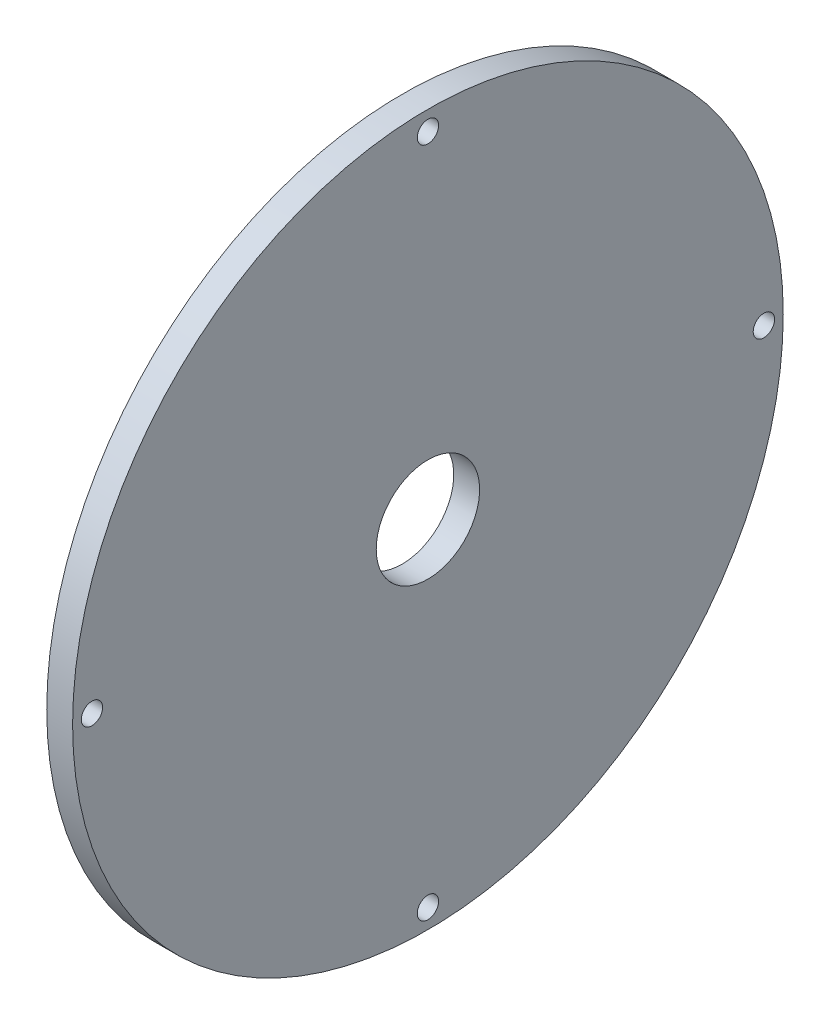
ISO-10303-21;
HEADER;
FILE_DESCRIPTION(('STEP AP214'),'2;1');
FILE_NAME('part.step','',(''),(''),'','','');
FILE_SCHEMA(('AUTOMOTIVE_DESIGN { 1 0 10303 214 1 1 1 1 }'));
ENDSEC;
DATA;
#1=APPLICATION_CONTEXT('core data for automotive mechanical design processes');
#2=APPLICATION_PROTOCOL_DEFINITION('international standard','automotive_design',2000,#1);
#3=PRODUCT_CONTEXT('',#1,'mechanical');
#4=PRODUCT('Part','Part','',(#3));
#5=PRODUCT_RELATED_PRODUCT_CATEGORY('part','',(#4));
#6=PRODUCT_DEFINITION_FORMATION('','',#4);
#7=PRODUCT_DEFINITION_CONTEXT('part definition',#1,'design');
#8=PRODUCT_DEFINITION('design','',#6,#7);
#9=PRODUCT_DEFINITION_SHAPE('','',#8);
#10=(LENGTH_UNIT() NAMED_UNIT(*) SI_UNIT(.MILLI.,.METRE.));
#11=(NAMED_UNIT(*) PLANE_ANGLE_UNIT() SI_UNIT($,.RADIAN.));
#12=(NAMED_UNIT(*) SI_UNIT($,.STERADIAN.) SOLID_ANGLE_UNIT());
#13=UNCERTAINTY_MEASURE_WITH_UNIT(LENGTH_MEASURE(1.E-05),#10,'distance_accuracy_value','');
#14=(GEOMETRIC_REPRESENTATION_CONTEXT(3) GLOBAL_UNCERTAINTY_ASSIGNED_CONTEXT((#13)) GLOBAL_UNIT_ASSIGNED_CONTEXT((#10,
#11,#12)) REPRESENTATION_CONTEXT('',''));
#15=CARTESIAN_POINT('',(0.,0.,0.));
#16=DIRECTION('',(0.,0.,1.));
#17=DIRECTION('',(1.,0.,0.));
#18=AXIS2_PLACEMENT_3D('',#15,#16,#17);
#19=CARTESIAN_POINT('',(-130.,55.,0.));
#20=DIRECTION('',(1.,0.,0.));
#21=DIRECTION('',(0.,0.,-1.));
#22=AXIS2_PLACEMENT_3D('',#19,#20,#21);
#23=PLANE('',#22);
#24=CARTESIAN_POINT('',(-130.,52.,0.));
#25=DIRECTION('',(1.,0.,0.));
#26=DIRECTION('',(0.,0.,-1.));
#27=AXIS2_PLACEMENT_3D('',#24,#25,#26);
#28=CIRCLE('',#27,1.65);
#29=CARTESIAN_POINT('',(-130.,52.,-1.65));
#30=VERTEX_POINT('',#29);
#31=EDGE_CURVE('E51',#30,#30,#28,.T.);
#32=ORIENTED_EDGE('',*,*,#31,.T.);
#33=EDGE_LOOP('',(#32));
#34=FACE_BOUND('',#33,.T.);
#35=CARTESIAN_POINT('',(-130.,0.,52.));
#36=DIRECTION('',(1.,0.,0.));
#37=DIRECTION('',(0.,0.,-1.));
#38=AXIS2_PLACEMENT_3D('',#35,#36,#37);
#39=CIRCLE('',#38,1.65);
#40=CARTESIAN_POINT('',(-130.,0.,50.35));
#41=VERTEX_POINT('',#40);
#42=EDGE_CURVE('E73',#41,#41,#39,.T.);
#43=ORIENTED_EDGE('',*,*,#42,.T.);
#44=EDGE_LOOP('',(#43));
#45=FACE_BOUND('',#44,.T.);
#46=CARTESIAN_POINT('',(-130.,-52.,0.));
#47=DIRECTION('',(1.,0.,0.));
#48=DIRECTION('',(0.,0.,-1.));
#49=AXIS2_PLACEMENT_3D('',#46,#47,#48);
#50=CIRCLE('',#49,1.65);
#51=CARTESIAN_POINT('',(-130.,-52.,-1.64999999999999));
#52=VERTEX_POINT('',#51);
#53=EDGE_CURVE('E70',#52,#52,#50,.T.);
#54=ORIENTED_EDGE('',*,*,#53,.T.);
#55=EDGE_LOOP('',(#54));
#56=FACE_BOUND('',#55,.T.);
#57=CARTESIAN_POINT('',(-130.,0.,-52.));
#58=DIRECTION('',(1.,0.,0.));
#59=DIRECTION('',(0.,0.,-1.));
#60=AXIS2_PLACEMENT_3D('',#57,#58,#59);
#61=CIRCLE('',#60,1.65);
#62=CARTESIAN_POINT('',(-130.,0.,-53.65));
#63=VERTEX_POINT('',#62);
#64=EDGE_CURVE('E67',#63,#63,#61,.T.);
#65=ORIENTED_EDGE('',*,*,#64,.T.);
#66=EDGE_LOOP('',(#65));
#67=FACE_BOUND('',#66,.T.);
#68=CARTESIAN_POINT('',(-130.,0.,0.));
#69=DIRECTION('',(-1.,0.,0.));
#70=DIRECTION('',(0.,0.,1.));
#71=AXIS2_PLACEMENT_3D('',#68,#69,#70);
#72=CIRCLE('',#71,8.);
#73=CARTESIAN_POINT('',(-130.,0.,8.));
#74=VERTEX_POINT('',#73);
#75=EDGE_CURVE('E10',#74,#74,#72,.T.);
#76=ORIENTED_EDGE('',*,*,#75,.F.);
#77=EDGE_LOOP('',(#76));
#78=FACE_BOUND('',#77,.T.);
#79=CARTESIAN_POINT('',(-130.,0.,0.));
#80=DIRECTION('',(-1.,0.,0.));
#81=DIRECTION('',(0.,0.,1.));
#82=AXIS2_PLACEMENT_3D('',#79,#80,#81);
#83=CIRCLE('',#82,55.);
#84=CARTESIAN_POINT('',(-130.,0.,55.));
#85=VERTEX_POINT('',#84);
#86=EDGE_CURVE('E58',#85,#85,#83,.T.);
#87=ORIENTED_EDGE('',*,*,#86,.T.);
#88=EDGE_LOOP('',(#87));
#89=FACE_BOUND('',#88,.T.);
#90=ADVANCED_FACE('F31',(#34,#45,#56,#67,#78,#89),#23,.F.);
#91=CARTESIAN_POINT('',(-110.,0.,0.));
#92=DIRECTION('',(-1.,0.,0.));
#93=DIRECTION('',(0.,0.,1.));
#94=AXIS2_PLACEMENT_3D('',#91,#92,#93);
#95=CYLINDRICAL_SURFACE('',#94,8.);
#96=CARTESIAN_POINT('',(-126.,0.,0.));
#97=DIRECTION('',(-1.,0.,0.));
#98=DIRECTION('',(0.,0.,1.));
#99=AXIS2_PLACEMENT_3D('',#96,#97,#98);
#100=CIRCLE('',#99,8.);
#101=CARTESIAN_POINT('',(-126.,0.,8.));
#102=VERTEX_POINT('',#101);
#103=EDGE_CURVE('E38',#102,#102,#100,.T.);
#104=ORIENTED_EDGE('',*,*,#103,.F.);
#105=EDGE_LOOP('',(#104));
#106=FACE_BOUND('',#105,.T.);
#107=ORIENTED_EDGE('',*,*,#75,.T.);
#108=EDGE_LOOP('',(#107));
#109=FACE_BOUND('',#108,.T.);
#110=ADVANCED_FACE('F93',(#106,#109),#95,.F.);
#111=CARTESIAN_POINT('',(-126.,8.,0.));
#112=DIRECTION('',(-1.,0.,0.));
#113=DIRECTION('',(0.,0.,1.));
#114=AXIS2_PLACEMENT_3D('',#111,#112,#113);
#115=PLANE('',#114);
#116=CARTESIAN_POINT('',(-126.,52.,0.));
#117=DIRECTION('',(-1.,0.,0.));
#118=DIRECTION('',(0.,0.,1.));
#119=AXIS2_PLACEMENT_3D('',#116,#117,#118);
#120=CIRCLE('',#119,1.65);
#121=CARTESIAN_POINT('',(-126.,52.,1.65));
#122=VERTEX_POINT('',#121);
#123=EDGE_CURVE('E34',#122,#122,#120,.T.);
#124=ORIENTED_EDGE('',*,*,#123,.T.);
#125=EDGE_LOOP('',(#124));
#126=FACE_BOUND('',#125,.T.);
#127=CARTESIAN_POINT('',(-126.,0.,52.));
#128=DIRECTION('',(-1.,0.,0.));
#129=DIRECTION('',(0.,0.,1.));
#130=AXIS2_PLACEMENT_3D('',#127,#128,#129);
#131=CIRCLE('',#130,1.65);
#132=CARTESIAN_POINT('',(-126.,0.,53.65));
#133=VERTEX_POINT('',#132);
#134=EDGE_CURVE('E53',#133,#133,#131,.T.);
#135=ORIENTED_EDGE('',*,*,#134,.T.);
#136=EDGE_LOOP('',(#135));
#137=FACE_BOUND('',#136,.T.);
#138=CARTESIAN_POINT('',(-126.,-52.,0.));
#139=DIRECTION('',(-1.,0.,0.));
#140=DIRECTION('',(0.,0.,1.));
#141=AXIS2_PLACEMENT_3D('',#138,#139,#140);
#142=CIRCLE('',#141,1.65);
#143=CARTESIAN_POINT('',(-126.,-52.,1.65000000000001));
#144=VERTEX_POINT('',#143);
#145=EDGE_CURVE('E50',#144,#144,#142,.T.);
#146=ORIENTED_EDGE('',*,*,#145,.T.);
#147=EDGE_LOOP('',(#146));
#148=FACE_BOUND('',#147,.T.);
#149=CARTESIAN_POINT('',(-126.,0.,-52.));
#150=DIRECTION('',(-1.,0.,0.));
#151=DIRECTION('',(0.,0.,1.));
#152=AXIS2_PLACEMENT_3D('',#149,#150,#151);
#153=CIRCLE('',#152,1.65);
#154=CARTESIAN_POINT('',(-126.,0.,-50.35));
#155=VERTEX_POINT('',#154);
#156=EDGE_CURVE('E47',#155,#155,#153,.T.);
#157=ORIENTED_EDGE('',*,*,#156,.T.);
#158=EDGE_LOOP('',(#157));
#159=FACE_BOUND('',#158,.T.);
#160=CARTESIAN_POINT('',(-126.,0.,0.));
#161=DIRECTION('',(-1.,0.,0.));
#162=DIRECTION('',(0.,0.,1.));
#163=AXIS2_PLACEMENT_3D('',#160,#161,#162);
#164=CIRCLE('',#163,55.);
#165=CARTESIAN_POINT('',(-126.,0.,55.));
#166=VERTEX_POINT('',#165);
#167=EDGE_CURVE('E43',#166,#166,#164,.T.);
#168=ORIENTED_EDGE('',*,*,#167,.F.);
#169=EDGE_LOOP('',(#168));
#170=FACE_BOUND('',#169,.T.);
#171=ORIENTED_EDGE('',*,*,#103,.T.);
#172=EDGE_LOOP('',(#171));
#173=FACE_BOUND('',#172,.T.);
#174=ADVANCED_FACE('F97',(#126,#137,#148,#159,#170,#173),#115,.F.);
#175=CARTESIAN_POINT('',(-110.,0.,0.));
#176=DIRECTION('',(-1.,0.,0.));
#177=DIRECTION('',(0.,0.,1.));
#178=AXIS2_PLACEMENT_3D('',#175,#176,#177);
#179=CYLINDRICAL_SURFACE('',#178,55.);
#180=ORIENTED_EDGE('',*,*,#86,.F.);
#181=EDGE_LOOP('',(#180));
#182=FACE_BOUND('',#181,.T.);
#183=ORIENTED_EDGE('',*,*,#167,.T.);
#184=EDGE_LOOP('',(#183));
#185=FACE_BOUND('',#184,.T.);
#186=ADVANCED_FACE('F102',(#182,#185),#179,.T.);
#187=CARTESIAN_POINT('',(-126.,0.,-52.));
#188=DIRECTION('',(1.,0.,0.));
#189=DIRECTION('',(0.,0.,-1.));
#190=AXIS2_PLACEMENT_3D('',#187,#188,#189);
#191=CYLINDRICAL_SURFACE('',#190,1.65);
#192=ORIENTED_EDGE('',*,*,#64,.F.);
#193=EDGE_LOOP('',(#192));
#194=FACE_BOUND('',#193,.T.);
#195=ORIENTED_EDGE('',*,*,#156,.F.);
#196=EDGE_LOOP('',(#195));
#197=FACE_BOUND('',#196,.T.);
#198=ADVANCED_FACE('F108',(#194,#197),#191,.F.);
#199=CARTESIAN_POINT('',(-126.,-52.,0.));
#200=DIRECTION('',(1.,0.,0.));
#201=DIRECTION('',(0.,0.,-1.));
#202=AXIS2_PLACEMENT_3D('',#199,#200,#201);
#203=CYLINDRICAL_SURFACE('',#202,1.65);
#204=ORIENTED_EDGE('',*,*,#53,.F.);
#205=EDGE_LOOP('',(#204));
#206=FACE_BOUND('',#205,.T.);
#207=ORIENTED_EDGE('',*,*,#145,.F.);
#208=EDGE_LOOP('',(#207));
#209=FACE_BOUND('',#208,.T.);
#210=ADVANCED_FACE('F89',(#206,#209),#203,.F.);
#211=CARTESIAN_POINT('',(-126.,0.,52.));
#212=DIRECTION('',(1.,0.,0.));
#213=DIRECTION('',(0.,0.,-1.));
#214=AXIS2_PLACEMENT_3D('',#211,#212,#213);
#215=CYLINDRICAL_SURFACE('',#214,1.65);
#216=ORIENTED_EDGE('',*,*,#42,.F.);
#217=EDGE_LOOP('',(#216));
#218=FACE_BOUND('',#217,.T.);
#219=ORIENTED_EDGE('',*,*,#134,.F.);
#220=EDGE_LOOP('',(#219));
#221=FACE_BOUND('',#220,.T.);
#222=ADVANCED_FACE('F84',(#218,#221),#215,.F.);
#223=CARTESIAN_POINT('',(-126.,52.,0.));
#224=DIRECTION('',(1.,0.,0.));
#225=DIRECTION('',(0.,0.,-1.));
#226=AXIS2_PLACEMENT_3D('',#223,#224,#225);
#227=CYLINDRICAL_SURFACE('',#226,1.65);
#228=ORIENTED_EDGE('',*,*,#31,.F.);
#229=EDGE_LOOP('',(#228));
#230=FACE_BOUND('',#229,.T.);
#231=ORIENTED_EDGE('',*,*,#123,.F.);
#232=EDGE_LOOP('',(#231));
#233=FACE_BOUND('',#232,.T.);
#234=ADVANCED_FACE('F81',(#230,#233),#227,.F.);
#235=CLOSED_SHELL('',(#90,#110,#174,#186,#198,#210,#222,#234));
#236=MANIFOLD_SOLID_BREP('B2',#235);
#237=ADVANCED_BREP_SHAPE_REPRESENTATION('',(#18,#236),#14);
#238=SHAPE_DEFINITION_REPRESENTATION(#9,#237);
ENDSEC;
END-ISO-10303-21;
